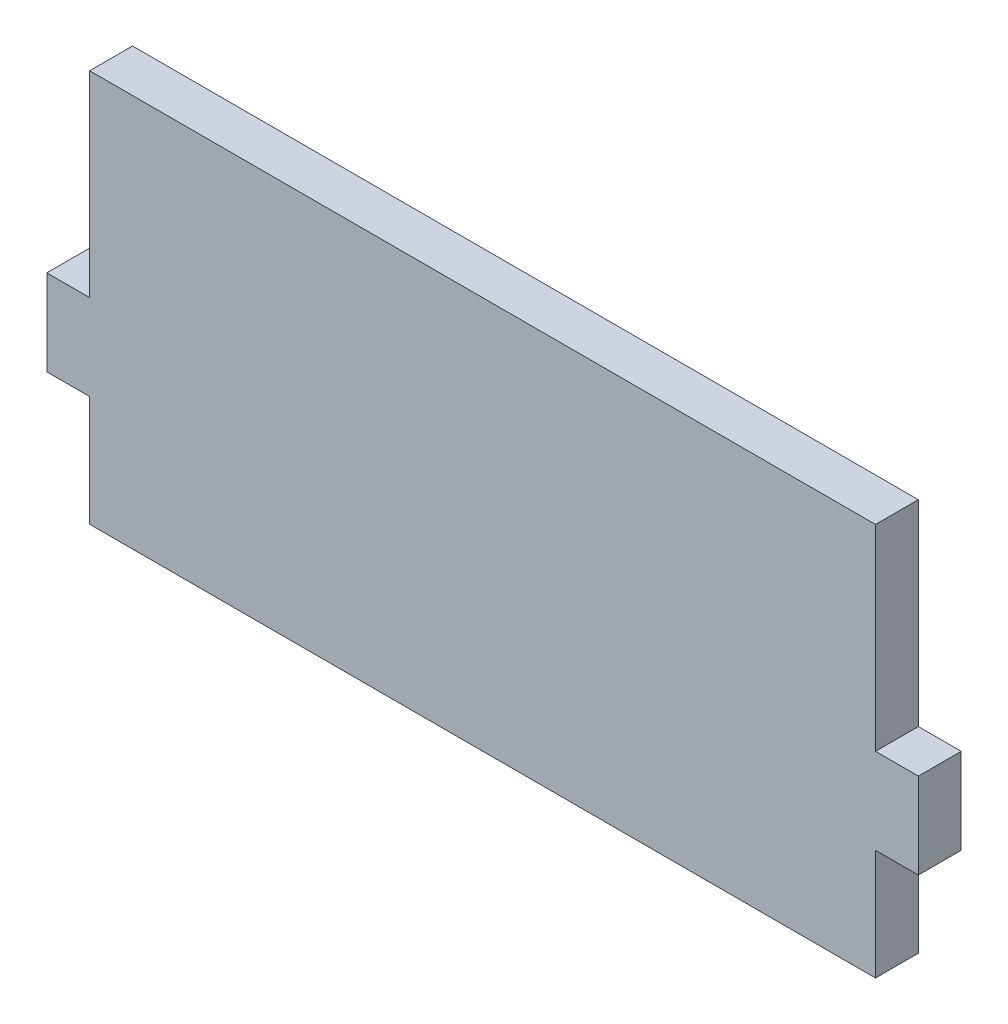
ISO-10303-21;
HEADER;
FILE_DESCRIPTION(('STEP AP214'),'2;1');
FILE_NAME('part.step','',(''),(''),'','','');
FILE_SCHEMA(('AUTOMOTIVE_DESIGN { 1 0 10303 214 1 1 1 1 }'));
ENDSEC;
DATA;
#1=APPLICATION_CONTEXT('core data for automotive mechanical design processes');
#2=APPLICATION_PROTOCOL_DEFINITION('international standard','automotive_design',2000,#1);
#3=PRODUCT_CONTEXT('',#1,'mechanical');
#4=PRODUCT('Part','Part','',(#3));
#5=PRODUCT_RELATED_PRODUCT_CATEGORY('part','',(#4));
#6=PRODUCT_DEFINITION_FORMATION('','',#4);
#7=PRODUCT_DEFINITION_CONTEXT('part definition',#1,'design');
#8=PRODUCT_DEFINITION('design','',#6,#7);
#9=PRODUCT_DEFINITION_SHAPE('','',#8);
#10=(LENGTH_UNIT() NAMED_UNIT(*) SI_UNIT(.MILLI.,.METRE.));
#11=(NAMED_UNIT(*) PLANE_ANGLE_UNIT() SI_UNIT($,.RADIAN.));
#12=(NAMED_UNIT(*) SI_UNIT($,.STERADIAN.) SOLID_ANGLE_UNIT());
#13=UNCERTAINTY_MEASURE_WITH_UNIT(LENGTH_MEASURE(1.E-05),#10,'distance_accuracy_value','');
#14=(GEOMETRIC_REPRESENTATION_CONTEXT(3) GLOBAL_UNCERTAINTY_ASSIGNED_CONTEXT((#13)) GLOBAL_UNIT_ASSIGNED_CONTEXT((#10,
#11,#12)) REPRESENTATION_CONTEXT('',''));
#15=CARTESIAN_POINT('',(0.,0.,0.));
#16=DIRECTION('',(0.,0.,1.));
#17=DIRECTION('',(1.,0.,0.));
#18=AXIS2_PLACEMENT_3D('',#15,#16,#17);
#19=CARTESIAN_POINT('',(0.,0.,3.));
#20=DIRECTION('',(1.,0.,0.));
#21=DIRECTION('',(0.,1.,0.));
#22=AXIS2_PLACEMENT_3D('',#19,#20,#21);
#23=PLANE('',#22);
#24=DIRECTION('',(0.,-1.,0.));
#25=VECTOR('',#24,1.);
#26=CARTESIAN_POINT('',(0.,0.,0.));
#27=LINE('',#26,#25);
#28=CARTESIAN_POINT('',(0.,0.,0.));
#29=VERTEX_POINT('',#28);
#30=CARTESIAN_POINT('',(0.,-13.75,0.));
#31=VERTEX_POINT('',#30);
#32=EDGE_CURVE('E159',#29,#31,#27,.T.);
#33=ORIENTED_EDGE('',*,*,#32,.T.);
#34=DIRECTION('',(0.,0.,-1.));
#35=VECTOR('',#34,1.);
#36=CARTESIAN_POINT('',(0.,-13.75,3.));
#37=LINE('',#36,#35);
#38=CARTESIAN_POINT('',(0.,-13.75,3.));
#39=VERTEX_POINT('',#38);
#40=EDGE_CURVE('E11',#39,#31,#37,.T.);
#41=ORIENTED_EDGE('',*,*,#40,.F.);
#42=DIRECTION('',(0.,-1.,0.));
#43=VECTOR('',#42,1.);
#44=CARTESIAN_POINT('',(0.,0.,3.));
#45=LINE('',#44,#43);
#46=CARTESIAN_POINT('',(0.,0.,3.));
#47=VERTEX_POINT('',#46);
#48=EDGE_CURVE('E181',#47,#39,#45,.T.);
#49=ORIENTED_EDGE('',*,*,#48,.F.);
#50=DIRECTION('',(0.,0.,-1.));
#51=VECTOR('',#50,1.);
#52=CARTESIAN_POINT('',(0.,0.,3.));
#53=LINE('',#52,#51);
#54=EDGE_CURVE('E155',#47,#29,#53,.T.);
#55=ORIENTED_EDGE('',*,*,#54,.T.);
#56=EDGE_LOOP('',(#33,#41,#49,#55));
#57=FACE_BOUND('',#56,.T.);
#58=ADVANCED_FACE('F39',(#57),#23,.F.);
#59=CARTESIAN_POINT('',(0.,-13.75,3.));
#60=DIRECTION('',(0.,-1.,0.));
#61=DIRECTION('',(1.,0.,0.));
#62=AXIS2_PLACEMENT_3D('',#59,#60,#61);
#63=PLANE('',#62);
#64=DIRECTION('',(-1.,0.,0.));
#65=VECTOR('',#64,1.);
#66=CARTESIAN_POINT('',(0.,-13.75,0.));
#67=LINE('',#66,#65);
#68=CARTESIAN_POINT('',(-3.,-13.75,0.));
#69=VERTEX_POINT('',#68);
#70=EDGE_CURVE('E162',#31,#69,#67,.T.);
#71=ORIENTED_EDGE('',*,*,#70,.T.);
#72=DIRECTION('',(0.,0.,-1.));
#73=VECTOR('',#72,1.);
#74=CARTESIAN_POINT('',(-3.,-13.75,3.));
#75=LINE('',#74,#73);
#76=CARTESIAN_POINT('',(-3.,-13.75,3.));
#77=VERTEX_POINT('',#76);
#78=EDGE_CURVE('E47',#77,#69,#75,.T.);
#79=ORIENTED_EDGE('',*,*,#78,.F.);
#80=DIRECTION('',(-1.,0.,0.));
#81=VECTOR('',#80,1.);
#82=CARTESIAN_POINT('',(0.,-13.75,3.));
#83=LINE('',#82,#81);
#84=EDGE_CURVE('E110',#39,#77,#83,.T.);
#85=ORIENTED_EDGE('',*,*,#84,.F.);
#86=ORIENTED_EDGE('',*,*,#40,.T.);
#87=EDGE_LOOP('',(#71,#79,#85,#86));
#88=FACE_BOUND('',#87,.T.);
#89=ADVANCED_FACE('F259',(#88),#63,.F.);
#90=CARTESIAN_POINT('',(-3.,-13.75,3.));
#91=DIRECTION('',(1.,0.,0.));
#92=DIRECTION('',(0.,1.,0.));
#93=AXIS2_PLACEMENT_3D('',#90,#91,#92);
#94=PLANE('',#93);
#95=DIRECTION('',(0.,-1.,0.));
#96=VECTOR('',#95,1.);
#97=CARTESIAN_POINT('',(-3.,-13.75,0.));
#98=LINE('',#97,#96);
#99=CARTESIAN_POINT('',(-2.99999999999999,-19.75,0.));
#100=VERTEX_POINT('',#99);
#101=EDGE_CURVE('E164',#69,#100,#98,.T.);
#102=ORIENTED_EDGE('',*,*,#101,.T.);
#103=DIRECTION('',(0.,0.,-1.));
#104=VECTOR('',#103,1.);
#105=CARTESIAN_POINT('',(-2.99999999999999,-19.75,3.));
#106=LINE('',#105,#104);
#107=CARTESIAN_POINT('',(-2.99999999999999,-19.75,3.));
#108=VERTEX_POINT('',#107);
#109=EDGE_CURVE('E200',#108,#100,#106,.T.);
#110=ORIENTED_EDGE('',*,*,#109,.F.);
#111=DIRECTION('',(0.,-1.,0.));
#112=VECTOR('',#111,1.);
#113=CARTESIAN_POINT('',(-3.,-13.75,3.));
#114=LINE('',#113,#112);
#115=EDGE_CURVE('E208',#77,#108,#114,.T.);
#116=ORIENTED_EDGE('',*,*,#115,.F.);
#117=ORIENTED_EDGE('',*,*,#78,.T.);
#118=EDGE_LOOP('',(#102,#110,#116,#117));
#119=FACE_BOUND('',#118,.T.);
#120=ADVANCED_FACE('F206',(#119),#94,.F.);
#121=CARTESIAN_POINT('',(0.,-19.75,3.));
#122=DIRECTION('',(0.,1.,0.));
#123=DIRECTION('',(0.,0.,1.));
#124=AXIS2_PLACEMENT_3D('',#121,#122,#123);
#125=PLANE('',#124);
#126=DIRECTION('',(1.,0.,0.));
#127=VECTOR('',#126,1.);
#128=CARTESIAN_POINT('',(0.,-19.75,0.));
#129=LINE('',#128,#127);
#130=CARTESIAN_POINT('',(0.,-19.75,0.));
#131=VERTEX_POINT('',#130);
#132=EDGE_CURVE('E166',#100,#131,#129,.T.);
#133=ORIENTED_EDGE('',*,*,#132,.T.);
#134=DIRECTION('',(0.,0.,-1.));
#135=VECTOR('',#134,1.);
#136=CARTESIAN_POINT('',(0.,-19.75,3.));
#137=LINE('',#136,#135);
#138=CARTESIAN_POINT('',(0.,-19.75,3.));
#139=VERTEX_POINT('',#138);
#140=EDGE_CURVE('E197',#139,#131,#137,.T.);
#141=ORIENTED_EDGE('',*,*,#140,.F.);
#142=DIRECTION('',(1.,0.,0.));
#143=VECTOR('',#142,1.);
#144=CARTESIAN_POINT('',(0.,-19.75,3.));
#145=LINE('',#144,#143);
#146=EDGE_CURVE('E226',#108,#139,#145,.T.);
#147=ORIENTED_EDGE('',*,*,#146,.F.);
#148=ORIENTED_EDGE('',*,*,#109,.T.);
#149=EDGE_LOOP('',(#133,#141,#147,#148));
#150=FACE_BOUND('',#149,.T.);
#151=ADVANCED_FACE('F217',(#150),#125,.F.);
#152=CARTESIAN_POINT('',(0.,-19.75,3.));
#153=DIRECTION('',(1.,0.,0.));
#154=DIRECTION('',(0.,1.,0.));
#155=AXIS2_PLACEMENT_3D('',#152,#153,#154);
#156=PLANE('',#155);
#157=DIRECTION('',(0.,-1.,0.));
#158=VECTOR('',#157,1.);
#159=CARTESIAN_POINT('',(0.,-19.75,0.));
#160=LINE('',#159,#158);
#161=CARTESIAN_POINT('',(0.,-27.49,0.));
#162=VERTEX_POINT('',#161);
#163=EDGE_CURVE('E168',#131,#162,#160,.T.);
#164=ORIENTED_EDGE('',*,*,#163,.T.);
#165=DIRECTION('',(0.,0.,-1.));
#166=VECTOR('',#165,1.);
#167=CARTESIAN_POINT('',(0.,-27.49,3.));
#168=LINE('',#167,#166);
#169=CARTESIAN_POINT('',(0.,-27.49,3.));
#170=VERTEX_POINT('',#169);
#171=EDGE_CURVE('E194',#170,#162,#168,.T.);
#172=ORIENTED_EDGE('',*,*,#171,.F.);
#173=DIRECTION('',(0.,-1.,0.));
#174=VECTOR('',#173,1.);
#175=CARTESIAN_POINT('',(0.,-19.75,3.));
#176=LINE('',#175,#174);
#177=EDGE_CURVE('E223',#139,#170,#176,.T.);
#178=ORIENTED_EDGE('',*,*,#177,.F.);
#179=ORIENTED_EDGE('',*,*,#140,.T.);
#180=EDGE_LOOP('',(#164,#172,#178,#179));
#181=FACE_BOUND('',#180,.T.);
#182=ADVANCED_FACE('F221',(#181),#156,.F.);
#183=CARTESIAN_POINT('',(0.,-27.49,3.));
#184=DIRECTION('',(0.,1.,0.));
#185=DIRECTION('',(0.,0.,1.));
#186=AXIS2_PLACEMENT_3D('',#183,#184,#185);
#187=PLANE('',#186);
#188=DIRECTION('',(1.,0.,0.));
#189=VECTOR('',#188,1.);
#190=CARTESIAN_POINT('',(0.,-27.49,0.));
#191=LINE('',#190,#189);
#192=CARTESIAN_POINT('',(55.,-27.49,0.));
#193=VERTEX_POINT('',#192);
#194=EDGE_CURVE('E170',#162,#193,#191,.T.);
#195=ORIENTED_EDGE('',*,*,#194,.T.);
#196=DIRECTION('',(0.,0.,-1.));
#197=VECTOR('',#196,1.);
#198=CARTESIAN_POINT('',(55.,-27.49,3.));
#199=LINE('',#198,#197);
#200=CARTESIAN_POINT('',(55.,-27.49,3.));
#201=VERTEX_POINT('',#200);
#202=EDGE_CURVE('E191',#201,#193,#199,.T.);
#203=ORIENTED_EDGE('',*,*,#202,.F.);
#204=DIRECTION('',(1.,0.,0.));
#205=VECTOR('',#204,1.);
#206=CARTESIAN_POINT('',(0.,-27.49,3.));
#207=LINE('',#206,#205);
#208=EDGE_CURVE('E225',#170,#201,#207,.T.);
#209=ORIENTED_EDGE('',*,*,#208,.F.);
#210=ORIENTED_EDGE('',*,*,#171,.T.);
#211=EDGE_LOOP('',(#195,#203,#209,#210));
#212=FACE_BOUND('',#211,.T.);
#213=ADVANCED_FACE('F272',(#212),#187,.F.);
#214=CARTESIAN_POINT('',(55.,-19.75,3.));
#215=DIRECTION('',(-1.,0.,0.));
#216=DIRECTION('',(0.,0.,1.));
#217=AXIS2_PLACEMENT_3D('',#214,#215,#216);
#218=PLANE('',#217);
#219=DIRECTION('',(0.,1.,0.));
#220=VECTOR('',#219,1.);
#221=CARTESIAN_POINT('',(55.,-19.75,0.));
#222=LINE('',#221,#220);
#223=CARTESIAN_POINT('',(55.,-19.75,0.));
#224=VERTEX_POINT('',#223);
#225=EDGE_CURVE('E172',#193,#224,#222,.T.);
#226=ORIENTED_EDGE('',*,*,#225,.T.);
#227=DIRECTION('',(0.,0.,-1.));
#228=VECTOR('',#227,1.);
#229=CARTESIAN_POINT('',(55.,-19.75,3.));
#230=LINE('',#229,#228);
#231=CARTESIAN_POINT('',(55.,-19.75,3.));
#232=VERTEX_POINT('',#231);
#233=EDGE_CURVE('E188',#232,#224,#230,.T.);
#234=ORIENTED_EDGE('',*,*,#233,.F.);
#235=DIRECTION('',(0.,1.,0.));
#236=VECTOR('',#235,1.);
#237=CARTESIAN_POINT('',(55.,-19.75,3.));
#238=LINE('',#237,#236);
#239=EDGE_CURVE('E228',#201,#232,#238,.T.);
#240=ORIENTED_EDGE('',*,*,#239,.F.);
#241=ORIENTED_EDGE('',*,*,#202,.T.);
#242=EDGE_LOOP('',(#226,#234,#240,#241));
#243=FACE_BOUND('',#242,.T.);
#244=ADVANCED_FACE('F275',(#243),#218,.F.);
#245=CARTESIAN_POINT('',(55.,-19.75,3.));
#246=DIRECTION('',(0.,1.,0.));
#247=DIRECTION('',(-1.,0.,0.));
#248=AXIS2_PLACEMENT_3D('',#245,#246,#247);
#249=PLANE('',#248);
#250=DIRECTION('',(1.,0.,0.));
#251=VECTOR('',#250,1.);
#252=CARTESIAN_POINT('',(55.,-19.75,0.));
#253=LINE('',#252,#251);
#254=CARTESIAN_POINT('',(58.,-19.75,0.));
#255=VERTEX_POINT('',#254);
#256=EDGE_CURVE('E174',#224,#255,#253,.T.);
#257=ORIENTED_EDGE('',*,*,#256,.T.);
#258=DIRECTION('',(0.,0.,-1.));
#259=VECTOR('',#258,1.);
#260=CARTESIAN_POINT('',(58.,-19.75,3.));
#261=LINE('',#260,#259);
#262=CARTESIAN_POINT('',(58.,-19.75,3.));
#263=VERTEX_POINT('',#262);
#264=EDGE_CURVE('E185',#263,#255,#261,.T.);
#265=ORIENTED_EDGE('',*,*,#264,.F.);
#266=DIRECTION('',(1.,0.,0.));
#267=VECTOR('',#266,1.);
#268=CARTESIAN_POINT('',(55.,-19.75,3.));
#269=LINE('',#268,#267);
#270=EDGE_CURVE('E234',#232,#263,#269,.T.);
#271=ORIENTED_EDGE('',*,*,#270,.F.);
#272=ORIENTED_EDGE('',*,*,#233,.T.);
#273=EDGE_LOOP('',(#257,#265,#271,#272));
#274=FACE_BOUND('',#273,.T.);
#275=ADVANCED_FACE('F240',(#274),#249,.F.);
#276=CARTESIAN_POINT('',(58.,-13.75,3.));
#277=DIRECTION('',(-1.,0.,0.));
#278=DIRECTION('',(0.,0.,1.));
#279=AXIS2_PLACEMENT_3D('',#276,#277,#278);
#280=PLANE('',#279);
#281=DIRECTION('',(0.,1.,0.));
#282=VECTOR('',#281,1.);
#283=CARTESIAN_POINT('',(58.,-13.75,0.));
#284=LINE('',#283,#282);
#285=CARTESIAN_POINT('',(58.,-13.75,0.));
#286=VERTEX_POINT('',#285);
#287=EDGE_CURVE('E176',#255,#286,#284,.T.);
#288=ORIENTED_EDGE('',*,*,#287,.T.);
#289=DIRECTION('',(0.,0.,-1.));
#290=VECTOR('',#289,1.);
#291=CARTESIAN_POINT('',(58.,-13.75,3.));
#292=LINE('',#291,#290);
#293=CARTESIAN_POINT('',(58.,-13.75,3.));
#294=VERTEX_POINT('',#293);
#295=EDGE_CURVE('E150',#294,#286,#292,.T.);
#296=ORIENTED_EDGE('',*,*,#295,.F.);
#297=DIRECTION('',(0.,1.,0.));
#298=VECTOR('',#297,1.);
#299=CARTESIAN_POINT('',(58.,-13.75,3.));
#300=LINE('',#299,#298);
#301=EDGE_CURVE('E141',#263,#294,#300,.T.);
#302=ORIENTED_EDGE('',*,*,#301,.F.);
#303=ORIENTED_EDGE('',*,*,#264,.T.);
#304=EDGE_LOOP('',(#288,#296,#302,#303));
#305=FACE_BOUND('',#304,.T.);
#306=ADVANCED_FACE('F244',(#305),#280,.F.);
#307=CARTESIAN_POINT('',(55.,-13.75,3.));
#308=DIRECTION('',(0.,-1.,0.));
#309=DIRECTION('',(1.,0.,0.));
#310=AXIS2_PLACEMENT_3D('',#307,#308,#309);
#311=PLANE('',#310);
#312=DIRECTION('',(-1.,0.,0.));
#313=VECTOR('',#312,1.);
#314=CARTESIAN_POINT('',(55.,-13.75,0.));
#315=LINE('',#314,#313);
#316=CARTESIAN_POINT('',(55.,-13.75,0.));
#317=VERTEX_POINT('',#316);
#318=EDGE_CURVE('E149',#286,#317,#315,.T.);
#319=ORIENTED_EDGE('',*,*,#318,.T.);
#320=DIRECTION('',(0.,0.,-1.));
#321=VECTOR('',#320,1.);
#322=CARTESIAN_POINT('',(55.,-13.75,3.));
#323=LINE('',#322,#321);
#324=CARTESIAN_POINT('',(55.,-13.75,3.));
#325=VERTEX_POINT('',#324);
#326=EDGE_CURVE('E146',#325,#317,#323,.T.);
#327=ORIENTED_EDGE('',*,*,#326,.F.);
#328=DIRECTION('',(-1.,0.,0.));
#329=VECTOR('',#328,1.);
#330=CARTESIAN_POINT('',(55.,-13.75,3.));
#331=LINE('',#330,#329);
#332=EDGE_CURVE('E135',#294,#325,#331,.T.);
#333=ORIENTED_EDGE('',*,*,#332,.F.);
#334=ORIENTED_EDGE('',*,*,#295,.T.);
#335=EDGE_LOOP('',(#319,#327,#333,#334));
#336=FACE_BOUND('',#335,.T.);
#337=ADVANCED_FACE('F147',(#336),#311,.F.);
#338=CARTESIAN_POINT('',(55.,0.,3.));
#339=DIRECTION('',(-1.,0.,0.));
#340=DIRECTION('',(0.,-1.,0.));
#341=AXIS2_PLACEMENT_3D('',#338,#339,#340);
#342=PLANE('',#341);
#343=DIRECTION('',(0.,1.,0.));
#344=VECTOR('',#343,1.);
#345=CARTESIAN_POINT('',(55.,0.,0.));
#346=LINE('',#345,#344);
#347=CARTESIAN_POINT('',(55.,0.,0.));
#348=VERTEX_POINT('',#347);
#349=EDGE_CURVE('E96',#317,#348,#346,.T.);
#350=ORIENTED_EDGE('',*,*,#349,.T.);
#351=DIRECTION('',(0.,0.,-1.));
#352=VECTOR('',#351,1.);
#353=CARTESIAN_POINT('',(55.,0.,3.));
#354=LINE('',#353,#352);
#355=CARTESIAN_POINT('',(55.,0.,3.));
#356=VERTEX_POINT('',#355);
#357=EDGE_CURVE('E151',#356,#348,#354,.T.);
#358=ORIENTED_EDGE('',*,*,#357,.F.);
#359=DIRECTION('',(0.,1.,0.));
#360=VECTOR('',#359,1.);
#361=CARTESIAN_POINT('',(55.,0.,3.));
#362=LINE('',#361,#360);
#363=EDGE_CURVE('E139',#325,#356,#362,.T.);
#364=ORIENTED_EDGE('',*,*,#363,.F.);
#365=ORIENTED_EDGE('',*,*,#326,.T.);
#366=EDGE_LOOP('',(#350,#358,#364,#365));
#367=FACE_BOUND('',#366,.T.);
#368=ADVANCED_FACE('F153',(#367),#342,.F.);
#369=CARTESIAN_POINT('',(0.,0.,3.));
#370=DIRECTION('',(0.,-1.,0.));
#371=DIRECTION('',(0.,0.,-1.));
#372=AXIS2_PLACEMENT_3D('',#369,#370,#371);
#373=PLANE('',#372);
#374=DIRECTION('',(-1.,0.,0.));
#375=VECTOR('',#374,1.);
#376=CARTESIAN_POINT('',(0.,0.,0.));
#377=LINE('',#376,#375);
#378=EDGE_CURVE('E102',#348,#29,#377,.T.);
#379=ORIENTED_EDGE('',*,*,#378,.T.);
#380=ORIENTED_EDGE('',*,*,#54,.F.);
#381=DIRECTION('',(-1.,0.,0.));
#382=VECTOR('',#381,1.);
#383=CARTESIAN_POINT('',(0.,0.,3.));
#384=LINE('',#383,#382);
#385=EDGE_CURVE('E55',#356,#47,#384,.T.);
#386=ORIENTED_EDGE('',*,*,#385,.F.);
#387=ORIENTED_EDGE('',*,*,#357,.T.);
#388=EDGE_LOOP('',(#379,#380,#386,#387));
#389=FACE_BOUND('',#388,.T.);
#390=ADVANCED_FACE('F248',(#389),#373,.F.);
#391=CARTESIAN_POINT('',(0.,0.,3.));
#392=DIRECTION('',(0.,0.,-1.));
#393=DIRECTION('',(-1.,0.,0.));
#394=AXIS2_PLACEMENT_3D('',#391,#392,#393);
#395=PLANE('',#394);
#396=ORIENTED_EDGE('',*,*,#48,.T.);
#397=ORIENTED_EDGE('',*,*,#84,.T.);
#398=ORIENTED_EDGE('',*,*,#115,.T.);
#399=ORIENTED_EDGE('',*,*,#146,.T.);
#400=ORIENTED_EDGE('',*,*,#177,.T.);
#401=ORIENTED_EDGE('',*,*,#208,.T.);
#402=ORIENTED_EDGE('',*,*,#239,.T.);
#403=ORIENTED_EDGE('',*,*,#270,.T.);
#404=ORIENTED_EDGE('',*,*,#301,.T.);
#405=ORIENTED_EDGE('',*,*,#332,.T.);
#406=ORIENTED_EDGE('',*,*,#363,.T.);
#407=ORIENTED_EDGE('',*,*,#385,.T.);
#408=EDGE_LOOP('',(#396,#397,#398,#399,#400,#401,#402,#403,#404,#405,#406,#407));
#409=FACE_BOUND('',#408,.T.);
#410=ADVANCED_FACE('F137',(#409),#395,.F.);
#411=CARTESIAN_POINT('',(0.,0.,0.));
#412=DIRECTION('',(0.,0.,-1.));
#413=DIRECTION('',(-1.,0.,0.));
#414=AXIS2_PLACEMENT_3D('',#411,#412,#413);
#415=PLANE('',#414);
#416=ORIENTED_EDGE('',*,*,#32,.F.);
#417=ORIENTED_EDGE('',*,*,#378,.F.);
#418=ORIENTED_EDGE('',*,*,#349,.F.);
#419=ORIENTED_EDGE('',*,*,#318,.F.);
#420=ORIENTED_EDGE('',*,*,#287,.F.);
#421=ORIENTED_EDGE('',*,*,#256,.F.);
#422=ORIENTED_EDGE('',*,*,#225,.F.);
#423=ORIENTED_EDGE('',*,*,#194,.F.);
#424=ORIENTED_EDGE('',*,*,#163,.F.);
#425=ORIENTED_EDGE('',*,*,#132,.F.);
#426=ORIENTED_EDGE('',*,*,#101,.F.);
#427=ORIENTED_EDGE('',*,*,#70,.F.);
#428=EDGE_LOOP('',(#416,#417,#418,#419,#420,#421,#422,#423,#424,#425,#426,#427));
#429=FACE_BOUND('',#428,.T.);
#430=ADVANCED_FACE('F212',(#429),#415,.T.);
#431=CLOSED_SHELL('',(#58,#89,#120,#151,#182,#213,#244,#275,#306,#337,#368,#390,#410,#430));
#432=MANIFOLD_SOLID_BREP('B2',#431);
#433=ADVANCED_BREP_SHAPE_REPRESENTATION('',(#18,#432),#14);
#434=SHAPE_DEFINITION_REPRESENTATION(#9,#433);
ENDSEC;
END-ISO-10303-21;
